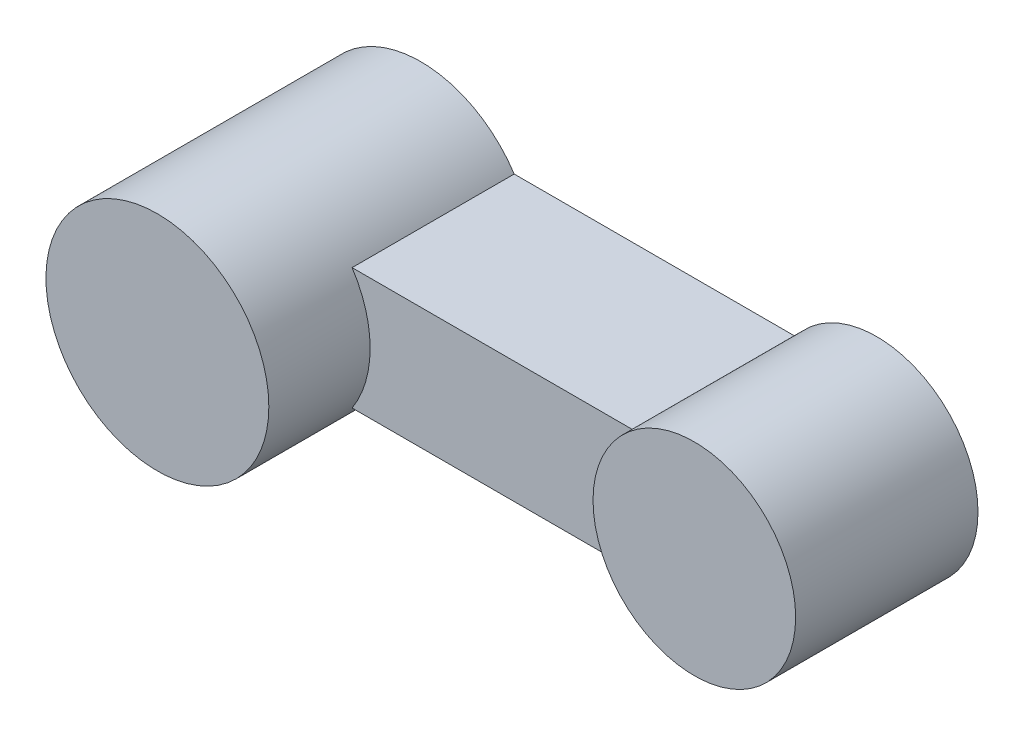
ISO-10303-21;
HEADER;
FILE_DESCRIPTION(('STEP AP214'),'2;1');
FILE_NAME('part.step','',(''),(''),'','','');
FILE_SCHEMA(('AUTOMOTIVE_DESIGN { 1 0 10303 214 1 1 1 1 }'));
ENDSEC;
DATA;
#1=APPLICATION_CONTEXT('core data for automotive mechanical design processes');
#2=APPLICATION_PROTOCOL_DEFINITION('international standard','automotive_design',2000,#1);
#3=PRODUCT_CONTEXT('',#1,'mechanical');
#4=PRODUCT('Part','Part','',(#3));
#5=PRODUCT_RELATED_PRODUCT_CATEGORY('part','',(#4));
#6=PRODUCT_DEFINITION_FORMATION('','',#4);
#7=PRODUCT_DEFINITION_CONTEXT('part definition',#1,'design');
#8=PRODUCT_DEFINITION('design','',#6,#7);
#9=PRODUCT_DEFINITION_SHAPE('','',#8);
#10=(LENGTH_UNIT() NAMED_UNIT(*) SI_UNIT(.MILLI.,.METRE.));
#11=(NAMED_UNIT(*) PLANE_ANGLE_UNIT() SI_UNIT($,.RADIAN.));
#12=(NAMED_UNIT(*) SI_UNIT($,.STERADIAN.) SOLID_ANGLE_UNIT());
#13=UNCERTAINTY_MEASURE_WITH_UNIT(LENGTH_MEASURE(1.E-05),#10,'distance_accuracy_value','');
#14=(GEOMETRIC_REPRESENTATION_CONTEXT(3) GLOBAL_UNCERTAINTY_ASSIGNED_CONTEXT((#13)) GLOBAL_UNIT_ASSIGNED_CONTEXT((#10,
#11,#12)) REPRESENTATION_CONTEXT('',''));
#15=CARTESIAN_POINT('',(0.,0.,0.));
#16=DIRECTION('',(0.,0.,1.));
#17=DIRECTION('',(1.,0.,0.));
#18=AXIS2_PLACEMENT_3D('',#15,#16,#17);
#19=CARTESIAN_POINT('',(20.,6.,16.));
#20=DIRECTION('',(0.,1.,0.));
#21=DIRECTION('',(0.,0.,1.));
#22=AXIS2_PLACEMENT_3D('',#19,#20,#21);
#23=PLANE('',#22);
#24=DIRECTION('',(0.,0.,-1.));
#25=VECTOR('',#24,1.);
#26=CARTESIAN_POINT('',(57.,6.,18.));
#27=LINE('',#26,#25);
#28=CARTESIAN_POINT('',(57.,6.,16.));
#29=VERTEX_POINT('',#28);
#30=CARTESIAN_POINT('',(57.,6.,0.));
#31=VERTEX_POINT('',#30);
#32=EDGE_CURVE('E84',#29,#31,#27,.T.);
#33=ORIENTED_EDGE('',*,*,#32,.F.);
#34=DIRECTION('',(1.,0.,0.));
#35=VECTOR('',#34,1.);
#36=CARTESIAN_POINT('',(20.,6.,16.));
#37=LINE('',#36,#35);
#38=CARTESIAN_POINT('',(29.2195444572929,6.,16.));
#39=VERTEX_POINT('',#38);
#40=EDGE_CURVE('E49',#39,#29,#37,.T.);
#41=ORIENTED_EDGE('',*,*,#40,.F.);
#42=DIRECTION('',(0.,0.,-1.));
#43=VECTOR('',#42,1.);
#44=CARTESIAN_POINT('',(29.2195444572929,6.,26.));
#45=LINE('',#44,#43);
#46=CARTESIAN_POINT('',(29.2195444572929,6.,0.));
#47=VERTEX_POINT('',#46);
#48=EDGE_CURVE('E65',#47,#39,#45,.F.);
#49=ORIENTED_EDGE('',*,*,#48,.F.);
#50=DIRECTION('',(1.,0.,0.));
#51=VECTOR('',#50,1.);
#52=CARTESIAN_POINT('',(20.,6.,0.));
#53=LINE('',#52,#51);
#54=EDGE_CURVE('E101',#47,#31,#53,.T.);
#55=ORIENTED_EDGE('',*,*,#54,.T.);
#56=EDGE_LOOP('',(#33,#41,#49,#55));
#57=FACE_BOUND('',#56,.T.);
#58=ADVANCED_FACE('F41',(#57),#23,.F.);
#59=CARTESIAN_POINT('',(65.,18.,16.));
#60=DIRECTION('',(0.,-1.,0.));
#61=DIRECTION('',(0.,0.,-1.));
#62=AXIS2_PLACEMENT_3D('',#59,#60,#61);
#63=PLANE('',#62);
#64=DIRECTION('',(0.,0.,-1.));
#65=VECTOR('',#64,1.);
#66=CARTESIAN_POINT('',(57.,18.,18.));
#67=LINE('',#66,#65);
#68=CARTESIAN_POINT('',(57.,18.,0.));
#69=VERTEX_POINT('',#68);
#70=CARTESIAN_POINT('',(57.,18.,16.));
#71=VERTEX_POINT('',#70);
#72=EDGE_CURVE('E57',#69,#71,#67,.F.);
#73=ORIENTED_EDGE('',*,*,#72,.F.);
#74=DIRECTION('',(-1.,0.,0.));
#75=VECTOR('',#74,1.);
#76=CARTESIAN_POINT('',(65.,18.,0.));
#77=LINE('',#76,#75);
#78=CARTESIAN_POINT('',(29.2195444572929,18.,0.));
#79=VERTEX_POINT('',#78);
#80=EDGE_CURVE('E44',#69,#79,#77,.T.);
#81=ORIENTED_EDGE('',*,*,#80,.T.);
#82=DIRECTION('',(0.,0.,-1.));
#83=VECTOR('',#82,1.);
#84=CARTESIAN_POINT('',(29.2195444572929,18.,26.));
#85=LINE('',#84,#83);
#86=CARTESIAN_POINT('',(29.2195444572929,18.,16.));
#87=VERTEX_POINT('',#86);
#88=EDGE_CURVE('E105',#87,#79,#85,.T.);
#89=ORIENTED_EDGE('',*,*,#88,.F.);
#90=DIRECTION('',(-1.,0.,0.));
#91=VECTOR('',#90,1.);
#92=CARTESIAN_POINT('',(65.,18.,16.));
#93=LINE('',#92,#91);
#94=EDGE_CURVE('E11',#71,#87,#93,.T.);
#95=ORIENTED_EDGE('',*,*,#94,.F.);
#96=EDGE_LOOP('',(#73,#81,#89,#95));
#97=FACE_BOUND('',#96,.T.);
#98=ADVANCED_FACE('F93',(#97),#63,.F.);
#99=CARTESIAN_POINT('',(0.,0.,16.));
#100=DIRECTION('',(0.,0.,1.));
#101=DIRECTION('',(1.,0.,0.));
#102=AXIS2_PLACEMENT_3D('',#99,#100,#101);
#103=PLANE('',#102);
#104=ORIENTED_EDGE('',*,*,#40,.T.);
#105=CARTESIAN_POINT('',(65.,12.,16.));
#106=DIRECTION('',(0.,0.,1.));
#107=DIRECTION('',(1.,0.,0.));
#108=AXIS2_PLACEMENT_3D('',#105,#106,#107);
#109=CIRCLE('',#108,9.99999999999999);
#110=EDGE_CURVE('E96',#29,#71,#109,.F.);
#111=ORIENTED_EDGE('',*,*,#110,.T.);
#112=ORIENTED_EDGE('',*,*,#94,.T.);
#113=CARTESIAN_POINT('',(20.,12.,16.));
#114=DIRECTION('',(0.,0.,1.));
#115=DIRECTION('',(1.,0.,0.));
#116=AXIS2_PLACEMENT_3D('',#113,#114,#115);
#117=CIRCLE('',#116,11.);
#118=EDGE_CURVE('E109',#87,#39,#117,.F.);
#119=ORIENTED_EDGE('',*,*,#118,.T.);
#120=EDGE_LOOP('',(#104,#111,#112,#119));
#121=FACE_BOUND('',#120,.T.);
#122=ADVANCED_FACE('F138',(#121),#103,.T.);
#123=CARTESIAN_POINT('',(0.,0.,0.));
#124=DIRECTION('',(0.,0.,1.));
#125=DIRECTION('',(1.,0.,0.));
#126=AXIS2_PLACEMENT_3D('',#123,#124,#125);
#127=PLANE('',#126);
#128=ORIENTED_EDGE('',*,*,#80,.F.);
#129=CARTESIAN_POINT('',(65.,12.,0.));
#130=DIRECTION('',(0.,0.,1.));
#131=DIRECTION('',(1.,0.,0.));
#132=AXIS2_PLACEMENT_3D('',#129,#130,#131);
#133=CIRCLE('',#132,9.99999999999999);
#134=EDGE_CURVE('E81',#31,#69,#133,.T.);
#135=ORIENTED_EDGE('',*,*,#134,.F.);
#136=ORIENTED_EDGE('',*,*,#54,.F.);
#137=CARTESIAN_POINT('',(20.,12.,0.));
#138=DIRECTION('',(0.,0.,1.));
#139=DIRECTION('',(1.,0.,0.));
#140=AXIS2_PLACEMENT_3D('',#137,#138,#139);
#141=CIRCLE('',#140,11.);
#142=EDGE_CURVE('E100',#79,#47,#141,.T.);
#143=ORIENTED_EDGE('',*,*,#142,.F.);
#144=EDGE_LOOP('',(#128,#135,#136,#143));
#145=FACE_BOUND('',#144,.T.);
#146=ADVANCED_FACE('F99',(#145),#127,.F.);
#147=CARTESIAN_POINT('',(20.,12.,26.));
#148=DIRECTION('',(0.,0.,-1.));
#149=DIRECTION('',(-1.,0.,0.));
#150=AXIS2_PLACEMENT_3D('',#147,#148,#149);
#151=CYLINDRICAL_SURFACE('',#150,11.);
#152=CARTESIAN_POINT('',(20.,12.,26.));
#153=DIRECTION('',(0.,0.,1.));
#154=DIRECTION('',(1.,0.,0.));
#155=AXIS2_PLACEMENT_3D('',#152,#153,#154);
#156=CIRCLE('',#155,11.);
#157=CARTESIAN_POINT('',(31.,12.,26.));
#158=VERTEX_POINT('',#157);
#159=EDGE_CURVE('E111',#158,#158,#156,.T.);
#160=ORIENTED_EDGE('',*,*,#159,.F.);
#161=EDGE_LOOP('',(#160));
#162=FACE_BOUND('',#161,.T.);
#163=ORIENTED_EDGE('',*,*,#142,.T.);
#164=ORIENTED_EDGE('',*,*,#48,.T.);
#165=ORIENTED_EDGE('',*,*,#118,.F.);
#166=ORIENTED_EDGE('',*,*,#88,.T.);
#167=EDGE_LOOP('',(#163,#164,#165,#166));
#168=FACE_BOUND('',#167,.T.);
#169=ADVANCED_FACE('F131',(#162,#168),#151,.T.);
#170=CARTESIAN_POINT('',(20.,12.,26.));
#171=DIRECTION('',(0.,0.,1.));
#172=DIRECTION('',(1.,0.,0.));
#173=AXIS2_PLACEMENT_3D('',#170,#171,#172);
#174=PLANE('',#173);
#175=ORIENTED_EDGE('',*,*,#159,.T.);
#176=EDGE_LOOP('',(#175));
#177=FACE_BOUND('',#176,.T.);
#178=ADVANCED_FACE('F123',(#177),#174,.T.);
#179=CARTESIAN_POINT('',(65.,12.,18.));
#180=DIRECTION('',(0.,0.,-1.));
#181=DIRECTION('',(-1.,0.,0.));
#182=AXIS2_PLACEMENT_3D('',#179,#180,#181);
#183=CYLINDRICAL_SURFACE('',#182,9.99999999999999);
#184=CARTESIAN_POINT('',(65.,12.,18.));
#185=DIRECTION('',(0.,0.,1.));
#186=DIRECTION('',(1.,0.,0.));
#187=AXIS2_PLACEMENT_3D('',#184,#185,#186);
#188=CIRCLE('',#187,9.99999999999999);
#189=CARTESIAN_POINT('',(75.,12.,18.));
#190=VERTEX_POINT('',#189);
#191=EDGE_CURVE('E89',#190,#190,#188,.T.);
#192=ORIENTED_EDGE('',*,*,#191,.F.);
#193=EDGE_LOOP('',(#192));
#194=FACE_BOUND('',#193,.T.);
#195=ORIENTED_EDGE('',*,*,#110,.F.);
#196=ORIENTED_EDGE('',*,*,#32,.T.);
#197=ORIENTED_EDGE('',*,*,#134,.T.);
#198=ORIENTED_EDGE('',*,*,#72,.T.);
#199=EDGE_LOOP('',(#195,#196,#197,#198));
#200=FACE_BOUND('',#199,.T.);
#201=ADVANCED_FACE('F82',(#194,#200),#183,.T.);
#202=CARTESIAN_POINT('',(65.,12.,18.));
#203=DIRECTION('',(0.,0.,1.));
#204=DIRECTION('',(1.,0.,0.));
#205=AXIS2_PLACEMENT_3D('',#202,#203,#204);
#206=PLANE('',#205);
#207=ORIENTED_EDGE('',*,*,#191,.T.);
#208=EDGE_LOOP('',(#207));
#209=FACE_BOUND('',#208,.T.);
#210=ADVANCED_FACE('F120',(#209),#206,.T.);
#211=CLOSED_SHELL('',(#58,#98,#122,#146,#169,#178,#201,#210));
#212=MANIFOLD_SOLID_BREP('B2',#211);
#213=ADVANCED_BREP_SHAPE_REPRESENTATION('',(#18,#212),#14);
#214=SHAPE_DEFINITION_REPRESENTATION(#9,#213);
ENDSEC;
END-ISO-10303-21;
